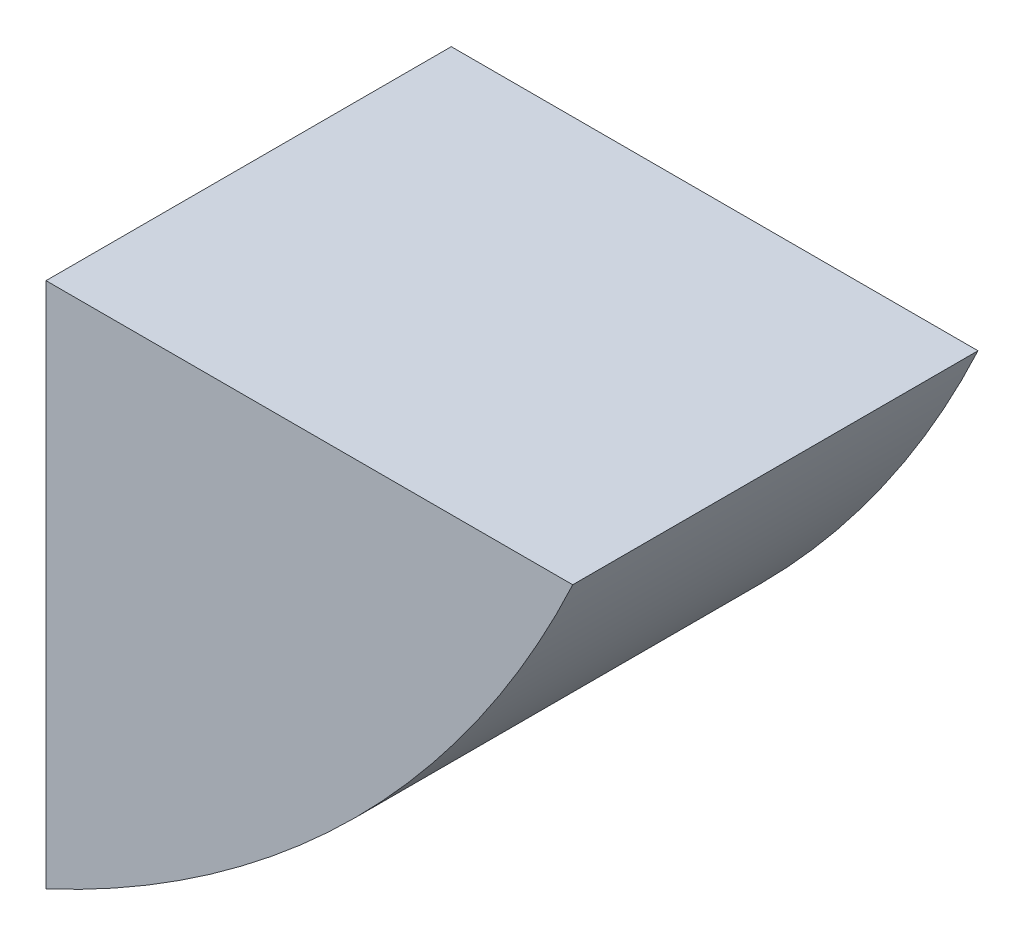
ISO-10303-21;
HEADER;
FILE_DESCRIPTION(('STEP AP214'),'2;1');
FILE_NAME('part.step','',(''),(''),'','','');
FILE_SCHEMA(('AUTOMOTIVE_DESIGN { 1 0 10303 214 1 1 1 1 }'));
ENDSEC;
DATA;
#1=APPLICATION_CONTEXT('core data for automotive mechanical design processes');
#2=APPLICATION_PROTOCOL_DEFINITION('international standard','automotive_design',2000,#1);
#3=PRODUCT_CONTEXT('',#1,'mechanical');
#4=PRODUCT('Part','Part','',(#3));
#5=PRODUCT_RELATED_PRODUCT_CATEGORY('part','',(#4));
#6=PRODUCT_DEFINITION_FORMATION('','',#4);
#7=PRODUCT_DEFINITION_CONTEXT('part definition',#1,'design');
#8=PRODUCT_DEFINITION('design','',#6,#7);
#9=PRODUCT_DEFINITION_SHAPE('','',#8);
#10=(LENGTH_UNIT() NAMED_UNIT(*) SI_UNIT(.MILLI.,.METRE.));
#11=(NAMED_UNIT(*) PLANE_ANGLE_UNIT() SI_UNIT($,.RADIAN.));
#12=(NAMED_UNIT(*) SI_UNIT($,.STERADIAN.) SOLID_ANGLE_UNIT());
#13=UNCERTAINTY_MEASURE_WITH_UNIT(LENGTH_MEASURE(1.E-05),#10,'distance_accuracy_value','');
#14=(GEOMETRIC_REPRESENTATION_CONTEXT(3) GLOBAL_UNCERTAINTY_ASSIGNED_CONTEXT((#13)) GLOBAL_UNIT_ASSIGNED_CONTEXT((#10,
#11,#12)) REPRESENTATION_CONTEXT('',''));
#15=CARTESIAN_POINT('',(0.,0.,0.));
#16=DIRECTION('',(0.,0.,1.));
#17=DIRECTION('',(1.,0.,0.));
#18=AXIS2_PLACEMENT_3D('',#15,#16,#17);
#19=CARTESIAN_POINT('',(21.59,-46.3483468102154,9.525));
#20=DIRECTION('',(-1.,0.,0.));
#21=DIRECTION('',(0.,-1.,0.));
#22=AXIS2_PLACEMENT_3D('',#19,#20,#21);
#23=PLANE('',#22);
#24=DIRECTION('',(0.,1.,0.));
#25=VECTOR('',#24,1.);
#26=CARTESIAN_POINT('',(21.59,-46.3483468102154,-9.525));
#27=LINE('',#26,#25);
#28=CARTESIAN_POINT('',(21.59,-46.3483468102154,-9.525));
#29=VERTEX_POINT('',#28);
#30=CARTESIAN_POINT('',(21.59,-21.59,-9.525));
#31=VERTEX_POINT('',#30);
#32=EDGE_CURVE('E101',#29,#31,#27,.T.);
#33=ORIENTED_EDGE('',*,*,#32,.F.);
#34=DIRECTION('',(0.,0.,-1.));
#35=VECTOR('',#34,1.);
#36=CARTESIAN_POINT('',(21.59,-46.3483468102154,9.525));
#37=LINE('',#36,#35);
#38=CARTESIAN_POINT('',(21.59,-46.3483468102154,9.525));
#39=VERTEX_POINT('',#38);
#40=EDGE_CURVE('E11',#39,#29,#37,.T.);
#41=ORIENTED_EDGE('',*,*,#40,.F.);
#42=DIRECTION('',(0.,1.,0.));
#43=VECTOR('',#42,1.);
#44=CARTESIAN_POINT('',(21.59,-46.3483468102154,9.525));
#45=LINE('',#44,#43);
#46=CARTESIAN_POINT('',(21.59,-21.59,9.525));
#47=VERTEX_POINT('',#46);
#48=EDGE_CURVE('E90',#39,#47,#45,.T.);
#49=ORIENTED_EDGE('',*,*,#48,.T.);
#50=DIRECTION('',(0.,0.,-1.));
#51=VECTOR('',#50,1.);
#52=CARTESIAN_POINT('',(21.59,-21.59,9.525));
#53=LINE('',#52,#51);
#54=EDGE_CURVE('E46',#47,#31,#53,.T.);
#55=ORIENTED_EDGE('',*,*,#54,.T.);
#56=EDGE_LOOP('',(#33,#41,#49,#55));
#57=FACE_BOUND('',#56,.T.);
#58=ADVANCED_FACE('F43',(#57),#23,.T.);
#59=CARTESIAN_POINT('',(0.,0.,9.525));
#60=DIRECTION('',(0.,0.,-1.));
#61=DIRECTION('',(-1.,0.,0.));
#62=AXIS2_PLACEMENT_3D('',#59,#60,#61);
#63=CYLINDRICAL_SURFACE('',#62,51.1302);
#64=CARTESIAN_POINT('',(0.,0.,-9.525));
#65=DIRECTION('',(0.,0.,1.));
#66=DIRECTION('',(1.,0.,0.));
#67=AXIS2_PLACEMENT_3D('',#64,#65,#66);
#68=CIRCLE('',#67,51.1302);
#69=CARTESIAN_POINT('',(46.3483468102153,-21.59,-9.525));
#70=VERTEX_POINT('',#69);
#71=EDGE_CURVE('E94',#29,#70,#68,.T.);
#72=ORIENTED_EDGE('',*,*,#71,.T.);
#73=DIRECTION('',(0.,0.,-1.));
#74=VECTOR('',#73,1.);
#75=CARTESIAN_POINT('',(46.3483468102153,-21.59,9.525));
#76=LINE('',#75,#74);
#77=CARTESIAN_POINT('',(46.3483468102153,-21.59,9.525));
#78=VERTEX_POINT('',#77);
#79=EDGE_CURVE('E53',#78,#70,#76,.T.);
#80=ORIENTED_EDGE('',*,*,#79,.F.);
#81=CARTESIAN_POINT('',(0.,0.,9.525));
#82=DIRECTION('',(0.,0.,1.));
#83=DIRECTION('',(1.,0.,0.));
#84=AXIS2_PLACEMENT_3D('',#81,#82,#83);
#85=CIRCLE('',#84,51.1302);
#86=EDGE_CURVE('E86',#39,#78,#85,.T.);
#87=ORIENTED_EDGE('',*,*,#86,.F.);
#88=ORIENTED_EDGE('',*,*,#40,.T.);
#89=EDGE_LOOP('',(#72,#80,#87,#88));
#90=FACE_BOUND('',#89,.T.);
#91=ADVANCED_FACE('F108',(#90),#63,.T.);
#92=CARTESIAN_POINT('',(21.59,-21.59,9.525));
#93=DIRECTION('',(0.,1.,0.));
#94=DIRECTION('',(0.,0.,1.));
#95=AXIS2_PLACEMENT_3D('',#92,#93,#94);
#96=PLANE('',#95);
#97=DIRECTION('',(1.,0.,0.));
#98=VECTOR('',#97,1.);
#99=CARTESIAN_POINT('',(21.59,-21.59,-9.525));
#100=LINE('',#99,#98);
#101=EDGE_CURVE('E83',#31,#70,#100,.T.);
#102=ORIENTED_EDGE('',*,*,#101,.F.);
#103=ORIENTED_EDGE('',*,*,#54,.F.);
#104=DIRECTION('',(1.,0.,0.));
#105=VECTOR('',#104,1.);
#106=CARTESIAN_POINT('',(21.59,-21.59,9.525));
#107=LINE('',#106,#105);
#108=EDGE_CURVE('E81',#47,#78,#107,.T.);
#109=ORIENTED_EDGE('',*,*,#108,.T.);
#110=ORIENTED_EDGE('',*,*,#79,.T.);
#111=EDGE_LOOP('',(#102,#103,#109,#110));
#112=FACE_BOUND('',#111,.T.);
#113=ADVANCED_FACE('F80',(#112),#96,.T.);
#114=CARTESIAN_POINT('',(0.,0.,9.525));
#115=DIRECTION('',(0.,0.,1.));
#116=DIRECTION('',(1.,0.,0.));
#117=AXIS2_PLACEMENT_3D('',#114,#115,#116);
#118=PLANE('',#117);
#119=ORIENTED_EDGE('',*,*,#48,.F.);
#120=ORIENTED_EDGE('',*,*,#86,.T.);
#121=ORIENTED_EDGE('',*,*,#108,.F.);
#122=EDGE_LOOP('',(#119,#120,#121));
#123=FACE_BOUND('',#122,.T.);
#124=ADVANCED_FACE('F89',(#123),#118,.T.);
#125=CARTESIAN_POINT('',(0.,0.,-9.525));
#126=DIRECTION('',(0.,0.,1.));
#127=DIRECTION('',(1.,0.,0.));
#128=AXIS2_PLACEMENT_3D('',#125,#126,#127);
#129=PLANE('',#128);
#130=ORIENTED_EDGE('',*,*,#32,.T.);
#131=ORIENTED_EDGE('',*,*,#101,.T.);
#132=ORIENTED_EDGE('',*,*,#71,.F.);
#133=EDGE_LOOP('',(#130,#131,#132));
#134=FACE_BOUND('',#133,.T.);
#135=ADVANCED_FACE('F107',(#134),#129,.F.);
#136=CLOSED_SHELL('',(#58,#91,#113,#124,#135));
#137=MANIFOLD_SOLID_BREP('B2',#136);
#138=ADVANCED_BREP_SHAPE_REPRESENTATION('',(#18,#137),#14);
#139=SHAPE_DEFINITION_REPRESENTATION(#9,#138);
ENDSEC;
END-ISO-10303-21;
